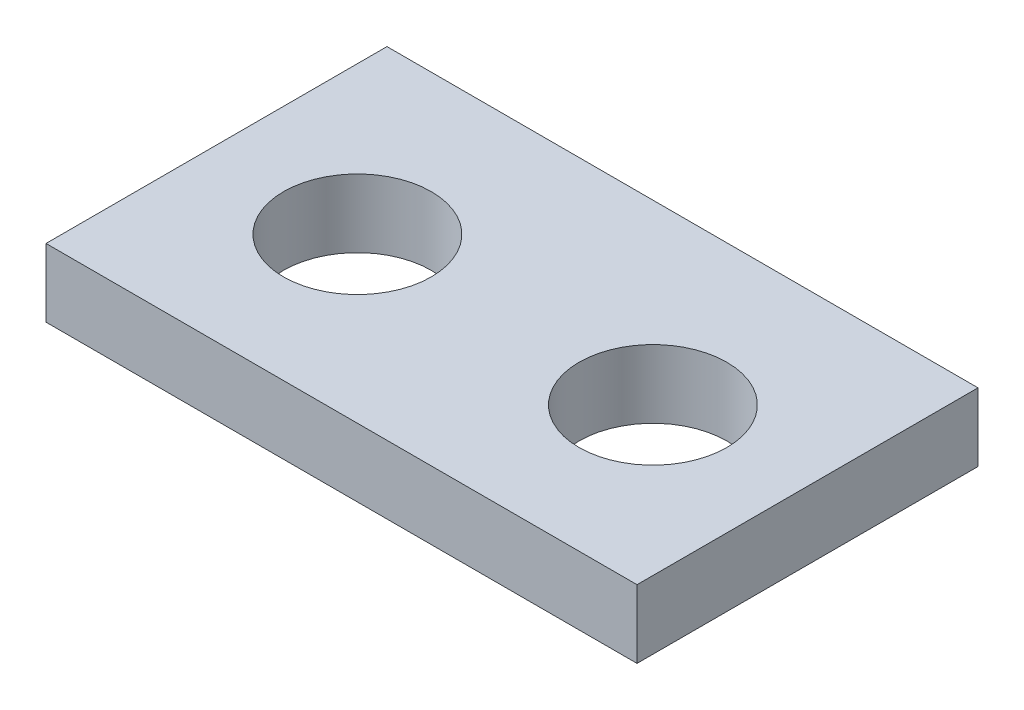
ISO-10303-21;
HEADER;
FILE_DESCRIPTION(('STEP AP214'),'2;1');
FILE_NAME('part.step','',(''),(''),'','','');
FILE_SCHEMA(('AUTOMOTIVE_DESIGN { 1 0 10303 214 1 1 1 1 }'));
ENDSEC;
DATA;
#1=APPLICATION_CONTEXT('core data for automotive mechanical design processes');
#2=APPLICATION_PROTOCOL_DEFINITION('international standard','automotive_design',2000,#1);
#3=PRODUCT_CONTEXT('',#1,'mechanical');
#4=PRODUCT('Part','Part','',(#3));
#5=PRODUCT_RELATED_PRODUCT_CATEGORY('part','',(#4));
#6=PRODUCT_DEFINITION_FORMATION('','',#4);
#7=PRODUCT_DEFINITION_CONTEXT('part definition',#1,'design');
#8=PRODUCT_DEFINITION('design','',#6,#7);
#9=PRODUCT_DEFINITION_SHAPE('','',#8);
#10=(LENGTH_UNIT() NAMED_UNIT(*) SI_UNIT(.MILLI.,.METRE.));
#11=(NAMED_UNIT(*) PLANE_ANGLE_UNIT() SI_UNIT($,.RADIAN.));
#12=(NAMED_UNIT(*) SI_UNIT($,.STERADIAN.) SOLID_ANGLE_UNIT());
#13=UNCERTAINTY_MEASURE_WITH_UNIT(LENGTH_MEASURE(1.E-05),#10,'distance_accuracy_value','');
#14=(GEOMETRIC_REPRESENTATION_CONTEXT(3) GLOBAL_UNCERTAINTY_ASSIGNED_CONTEXT((#13)) GLOBAL_UNIT_ASSIGNED_CONTEXT((#10,
#11,#12)) REPRESENTATION_CONTEXT('',''));
#15=CARTESIAN_POINT('',(0.,0.,0.));
#16=DIRECTION('',(0.,0.,1.));
#17=DIRECTION('',(1.,0.,0.));
#18=AXIS2_PLACEMENT_3D('',#15,#16,#17);
#19=CARTESIAN_POINT('',(0.,-3.,0.));
#20=DIRECTION('',(-1.,0.,0.));
#21=DIRECTION('',(0.,0.,1.));
#22=AXIS2_PLACEMENT_3D('',#19,#20,#21);
#23=PLANE('',#22);
#24=DIRECTION('',(0.,0.,1.));
#25=VECTOR('',#24,1.);
#26=CARTESIAN_POINT('',(0.,0.,0.));
#27=LINE('',#26,#25);
#28=CARTESIAN_POINT('',(0.,0.,-15.));
#29=VERTEX_POINT('',#28);
#30=CARTESIAN_POINT('',(0.,0.,0.));
#31=VERTEX_POINT('',#30);
#32=EDGE_CURVE('E111',#29,#31,#27,.T.);
#33=ORIENTED_EDGE('',*,*,#32,.F.);
#34=DIRECTION('',(0.,1.,0.));
#35=VECTOR('',#34,1.);
#36=CARTESIAN_POINT('',(0.,-3.,-15.));
#37=LINE('',#36,#35);
#38=CARTESIAN_POINT('',(0.,-3.,-15.));
#39=VERTEX_POINT('',#38);
#40=EDGE_CURVE('E11',#39,#29,#37,.T.);
#41=ORIENTED_EDGE('',*,*,#40,.F.);
#42=DIRECTION('',(0.,0.,1.));
#43=VECTOR('',#42,1.);
#44=CARTESIAN_POINT('',(0.,-3.,0.));
#45=LINE('',#44,#43);
#46=CARTESIAN_POINT('',(0.,-3.,0.));
#47=VERTEX_POINT('',#46);
#48=EDGE_CURVE('E100',#39,#47,#45,.T.);
#49=ORIENTED_EDGE('',*,*,#48,.T.);
#50=DIRECTION('',(0.,1.,0.));
#51=VECTOR('',#50,1.);
#52=CARTESIAN_POINT('',(0.,-3.,0.));
#53=LINE('',#52,#51);
#54=EDGE_CURVE('E41',#47,#31,#53,.T.);
#55=ORIENTED_EDGE('',*,*,#54,.T.);
#56=EDGE_LOOP('',(#33,#41,#49,#55));
#57=FACE_BOUND('',#56,.T.);
#58=ADVANCED_FACE('F38',(#57),#23,.T.);
#59=CARTESIAN_POINT('',(0.,-3.,-15.));
#60=DIRECTION('',(0.,0.,-1.));
#61=DIRECTION('',(-1.,0.,0.));
#62=AXIS2_PLACEMENT_3D('',#59,#60,#61);
#63=PLANE('',#62);
#64=DIRECTION('',(-1.,0.,0.));
#65=VECTOR('',#64,1.);
#66=CARTESIAN_POINT('',(0.,0.,-15.));
#67=LINE('',#66,#65);
#68=CARTESIAN_POINT('',(26.,0.,-15.));
#69=VERTEX_POINT('',#68);
#70=EDGE_CURVE('E105',#69,#29,#67,.T.);
#71=ORIENTED_EDGE('',*,*,#70,.F.);
#72=DIRECTION('',(0.,1.,0.));
#73=VECTOR('',#72,1.);
#74=CARTESIAN_POINT('',(26.,-3.,-15.));
#75=LINE('',#74,#73);
#76=CARTESIAN_POINT('',(26.,-3.,-15.));
#77=VERTEX_POINT('',#76);
#78=EDGE_CURVE('E48',#77,#69,#75,.T.);
#79=ORIENTED_EDGE('',*,*,#78,.F.);
#80=DIRECTION('',(-1.,0.,0.));
#81=VECTOR('',#80,1.);
#82=CARTESIAN_POINT('',(0.,-3.,-15.));
#83=LINE('',#82,#81);
#84=EDGE_CURVE('E95',#77,#39,#83,.T.);
#85=ORIENTED_EDGE('',*,*,#84,.T.);
#86=ORIENTED_EDGE('',*,*,#40,.T.);
#87=EDGE_LOOP('',(#71,#79,#85,#86));
#88=FACE_BOUND('',#87,.T.);
#89=ADVANCED_FACE('F181',(#88),#63,.T.);
#90=CARTESIAN_POINT('',(26.,-3.,0.));
#91=DIRECTION('',(1.,0.,0.));
#92=DIRECTION('',(0.,0.,-1.));
#93=AXIS2_PLACEMENT_3D('',#90,#91,#92);
#94=PLANE('',#93);
#95=DIRECTION('',(0.,0.,-1.));
#96=VECTOR('',#95,1.);
#97=CARTESIAN_POINT('',(26.,0.,0.));
#98=LINE('',#97,#96);
#99=CARTESIAN_POINT('',(26.,0.,0.));
#100=VERTEX_POINT('',#99);
#101=EDGE_CURVE('E89',#100,#69,#98,.T.);
#102=ORIENTED_EDGE('',*,*,#101,.F.);
#103=DIRECTION('',(0.,1.,0.));
#104=VECTOR('',#103,1.);
#105=CARTESIAN_POINT('',(26.,-3.,0.));
#106=LINE('',#105,#104);
#107=CARTESIAN_POINT('',(26.,-3.,0.));
#108=VERTEX_POINT('',#107);
#109=EDGE_CURVE('E84',#108,#100,#106,.T.);
#110=ORIENTED_EDGE('',*,*,#109,.F.);
#111=DIRECTION('',(0.,0.,-1.));
#112=VECTOR('',#111,1.);
#113=CARTESIAN_POINT('',(26.,-3.,0.));
#114=LINE('',#113,#112);
#115=EDGE_CURVE('E87',#108,#77,#114,.T.);
#116=ORIENTED_EDGE('',*,*,#115,.T.);
#117=ORIENTED_EDGE('',*,*,#78,.T.);
#118=EDGE_LOOP('',(#102,#110,#116,#117));
#119=FACE_BOUND('',#118,.T.);
#120=ADVANCED_FACE('F86',(#119),#94,.T.);
#121=CARTESIAN_POINT('',(0.,-3.,0.));
#122=DIRECTION('',(0.,0.,1.));
#123=DIRECTION('',(1.,0.,0.));
#124=AXIS2_PLACEMENT_3D('',#121,#122,#123);
#125=PLANE('',#124);
#126=DIRECTION('',(1.,0.,0.));
#127=VECTOR('',#126,1.);
#128=CARTESIAN_POINT('',(0.,0.,0.));
#129=LINE('',#128,#127);
#130=EDGE_CURVE('E115',#31,#100,#129,.T.);
#131=ORIENTED_EDGE('',*,*,#130,.F.);
#132=ORIENTED_EDGE('',*,*,#54,.F.);
#133=DIRECTION('',(1.,0.,0.));
#134=VECTOR('',#133,1.);
#135=CARTESIAN_POINT('',(0.,-3.,0.));
#136=LINE('',#135,#134);
#137=EDGE_CURVE('E94',#47,#108,#136,.T.);
#138=ORIENTED_EDGE('',*,*,#137,.T.);
#139=ORIENTED_EDGE('',*,*,#109,.T.);
#140=EDGE_LOOP('',(#131,#132,#138,#139));
#141=FACE_BOUND('',#140,.T.);
#142=ADVANCED_FACE('F98',(#141),#125,.T.);
#143=CARTESIAN_POINT('',(0.,-3.,0.));
#144=DIRECTION('',(0.,-1.,0.));
#145=DIRECTION('',(0.,0.,-1.));
#146=AXIS2_PLACEMENT_3D('',#143,#144,#145);
#147=PLANE('',#146);
#148=CARTESIAN_POINT('',(19.5,-3.,-7.2));
#149=DIRECTION('',(0.,1.,0.));
#150=DIRECTION('',(0.,0.,1.));
#151=AXIS2_PLACEMENT_3D('',#148,#149,#150);
#152=CIRCLE('',#151,3.25);
#153=CARTESIAN_POINT('',(19.5,-3.,-3.95));
#154=VERTEX_POINT('',#153);
#155=EDGE_CURVE('E161',#154,#154,#152,.T.);
#156=ORIENTED_EDGE('',*,*,#155,.T.);
#157=EDGE_LOOP('',(#156));
#158=FACE_BOUND('',#157,.T.);
#159=CARTESIAN_POINT('',(6.5,-3.,-7.2));
#160=DIRECTION('',(0.,1.,0.));
#161=DIRECTION('',(0.,0.,1.));
#162=AXIS2_PLACEMENT_3D('',#159,#160,#161);
#163=CIRCLE('',#162,3.25);
#164=CARTESIAN_POINT('',(6.5,-3.,-3.95));
#165=VERTEX_POINT('',#164);
#166=EDGE_CURVE('E116',#165,#165,#163,.T.);
#167=ORIENTED_EDGE('',*,*,#166,.T.);
#168=EDGE_LOOP('',(#167));
#169=FACE_BOUND('',#168,.T.);
#170=ORIENTED_EDGE('',*,*,#48,.F.);
#171=ORIENTED_EDGE('',*,*,#84,.F.);
#172=ORIENTED_EDGE('',*,*,#115,.F.);
#173=ORIENTED_EDGE('',*,*,#137,.F.);
#174=EDGE_LOOP('',(#170,#171,#172,#173));
#175=FACE_BOUND('',#174,.T.);
#176=ADVANCED_FACE('F93',(#158,#169,#175),#147,.T.);
#177=CARTESIAN_POINT('',(0.,0.,0.));
#178=DIRECTION('',(0.,-1.,0.));
#179=DIRECTION('',(0.,0.,-1.));
#180=AXIS2_PLACEMENT_3D('',#177,#178,#179);
#181=PLANE('',#180);
#182=CARTESIAN_POINT('',(19.5,0.,-7.2));
#183=DIRECTION('',(0.,1.,0.));
#184=DIRECTION('',(0.,0.,1.));
#185=AXIS2_PLACEMENT_3D('',#182,#183,#184);
#186=CIRCLE('',#185,3.25);
#187=CARTESIAN_POINT('',(19.5,0.,-3.95));
#188=VERTEX_POINT('',#187);
#189=EDGE_CURVE('E165',#188,#188,#186,.T.);
#190=ORIENTED_EDGE('',*,*,#189,.F.);
#191=EDGE_LOOP('',(#190));
#192=FACE_BOUND('',#191,.T.);
#193=CARTESIAN_POINT('',(6.5,0.,-7.2));
#194=DIRECTION('',(0.,1.,0.));
#195=DIRECTION('',(0.,0.,1.));
#196=AXIS2_PLACEMENT_3D('',#193,#194,#195);
#197=CIRCLE('',#196,3.25);
#198=CARTESIAN_POINT('',(6.5,0.,-3.95));
#199=VERTEX_POINT('',#198);
#200=EDGE_CURVE('E156',#199,#199,#197,.T.);
#201=ORIENTED_EDGE('',*,*,#200,.F.);
#202=EDGE_LOOP('',(#201));
#203=FACE_BOUND('',#202,.T.);
#204=ORIENTED_EDGE('',*,*,#32,.T.);
#205=ORIENTED_EDGE('',*,*,#130,.T.);
#206=ORIENTED_EDGE('',*,*,#101,.T.);
#207=ORIENTED_EDGE('',*,*,#70,.T.);
#208=EDGE_LOOP('',(#204,#205,#206,#207));
#209=FACE_BOUND('',#208,.T.);
#210=ADVANCED_FACE('F174',(#192,#203,#209),#181,.F.);
#211=CARTESIAN_POINT('',(6.5,-3.,-7.2));
#212=DIRECTION('',(0.,1.,0.));
#213=DIRECTION('',(0.,0.,1.));
#214=AXIS2_PLACEMENT_3D('',#211,#212,#213);
#215=CYLINDRICAL_SURFACE('',#214,3.25);
#216=ORIENTED_EDGE('',*,*,#166,.F.);
#217=EDGE_LOOP('',(#216));
#218=FACE_BOUND('',#217,.T.);
#219=ORIENTED_EDGE('',*,*,#200,.T.);
#220=EDGE_LOOP('',(#219));
#221=FACE_BOUND('',#220,.T.);
#222=ADVANCED_FACE('F177',(#218,#221),#215,.F.);
#223=CARTESIAN_POINT('',(19.5,-3.,-7.2));
#224=DIRECTION('',(0.,1.,0.));
#225=DIRECTION('',(0.,0.,1.));
#226=AXIS2_PLACEMENT_3D('',#223,#224,#225);
#227=CYLINDRICAL_SURFACE('',#226,3.25);
#228=ORIENTED_EDGE('',*,*,#155,.F.);
#229=EDGE_LOOP('',(#228));
#230=FACE_BOUND('',#229,.T.);
#231=ORIENTED_EDGE('',*,*,#189,.T.);
#232=EDGE_LOOP('',(#231));
#233=FACE_BOUND('',#232,.T.);
#234=ADVANCED_FACE('F172',(#230,#233),#227,.F.);
#235=CLOSED_SHELL('',(#58,#89,#120,#142,#176,#210,#222,#234));
#236=MANIFOLD_SOLID_BREP('B2',#235);
#237=ADVANCED_BREP_SHAPE_REPRESENTATION('',(#18,#236),#14);
#238=SHAPE_DEFINITION_REPRESENTATION(#9,#237);
ENDSEC;
END-ISO-10303-21;
